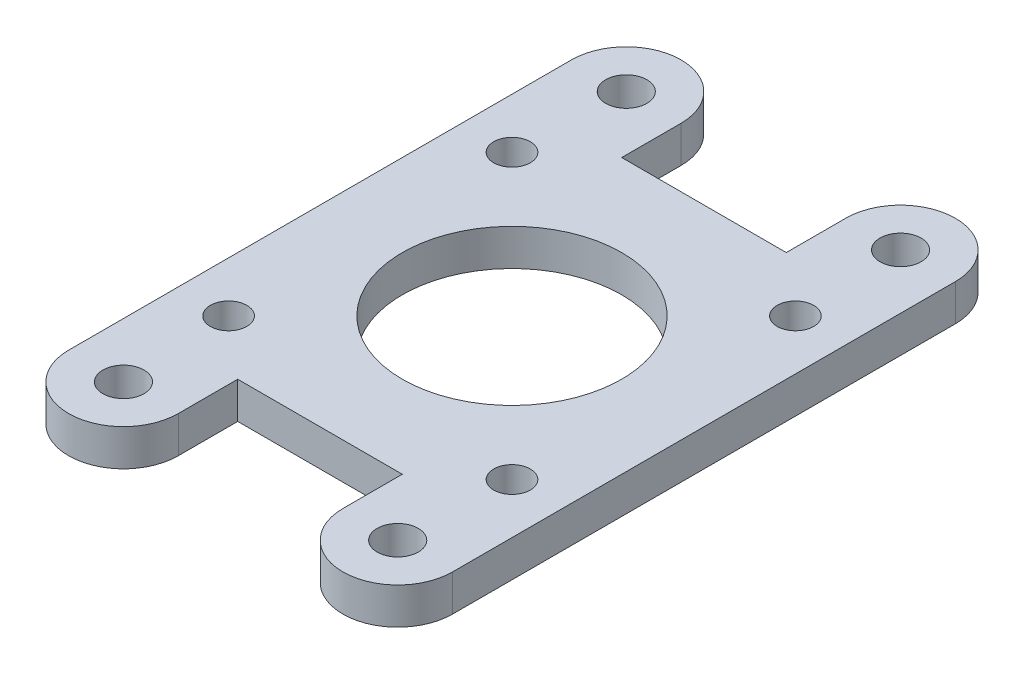
ISO-10303-21;
HEADER;
FILE_DESCRIPTION(('STEP AP214'),'2;1');
FILE_NAME('part.step','',(''),(''),'','','');
FILE_SCHEMA(('AUTOMOTIVE_DESIGN { 1 0 10303 214 1 1 1 1 }'));
ENDSEC;
DATA;
#1=APPLICATION_CONTEXT('core data for automotive mechanical design processes');
#2=APPLICATION_PROTOCOL_DEFINITION('international standard','automotive_design',2000,#1);
#3=PRODUCT_CONTEXT('',#1,'mechanical');
#4=PRODUCT('Part','Part','',(#3));
#5=PRODUCT_RELATED_PRODUCT_CATEGORY('part','',(#4));
#6=PRODUCT_DEFINITION_FORMATION('','',#4);
#7=PRODUCT_DEFINITION_CONTEXT('part definition',#1,'design');
#8=PRODUCT_DEFINITION('design','',#6,#7);
#9=PRODUCT_DEFINITION_SHAPE('','',#8);
#10=(LENGTH_UNIT() NAMED_UNIT(*) SI_UNIT(.MILLI.,.METRE.));
#11=(NAMED_UNIT(*) PLANE_ANGLE_UNIT() SI_UNIT($,.RADIAN.));
#12=(NAMED_UNIT(*) SI_UNIT($,.STERADIAN.) SOLID_ANGLE_UNIT());
#13=UNCERTAINTY_MEASURE_WITH_UNIT(LENGTH_MEASURE(1.E-05),#10,'distance_accuracy_value','');
#14=(GEOMETRIC_REPRESENTATION_CONTEXT(3) GLOBAL_UNCERTAINTY_ASSIGNED_CONTEXT((#13)) GLOBAL_UNIT_ASSIGNED_CONTEXT((#10,
#11,#12)) REPRESENTATION_CONTEXT('',''));
#15=CARTESIAN_POINT('',(0.,0.,0.));
#16=DIRECTION('',(0.,0.,1.));
#17=DIRECTION('',(1.,0.,0.));
#18=AXIS2_PLACEMENT_3D('',#15,#16,#17);
#19=CARTESIAN_POINT('',(-21.,-4.,-21.));
#20=DIRECTION('',(-1.,0.,0.));
#21=DIRECTION('',(0.,0.,1.));
#22=AXIS2_PLACEMENT_3D('',#19,#20,#21);
#23=PLANE('',#22);
#24=DIRECTION('',(0.,0.,1.));
#25=VECTOR('',#24,1.);
#26=CARTESIAN_POINT('',(-21.,0.,-21.));
#27=LINE('',#26,#25);
#28=CARTESIAN_POINT('',(-21.,0.,-27.5));
#29=VERTEX_POINT('',#28);
#30=CARTESIAN_POINT('',(-21.,0.,27.5));
#31=VERTEX_POINT('',#30);
#32=EDGE_CURVE('E230',#29,#31,#27,.T.);
#33=ORIENTED_EDGE('',*,*,#32,.F.);
#34=DIRECTION('',(0.,1.,0.));
#35=VECTOR('',#34,1.);
#36=CARTESIAN_POINT('',(-21.,-4.,-27.5));
#37=LINE('',#36,#35);
#38=CARTESIAN_POINT('',(-21.,-4.,-27.5));
#39=VERTEX_POINT('',#38);
#40=EDGE_CURVE('E208',#39,#29,#37,.T.);
#41=ORIENTED_EDGE('',*,*,#40,.F.);
#42=DIRECTION('',(0.,0.,1.));
#43=VECTOR('',#42,1.);
#44=CARTESIAN_POINT('',(-21.,-4.,-21.));
#45=LINE('',#44,#43);
#46=CARTESIAN_POINT('',(-21.,-4.,27.5));
#47=VERTEX_POINT('',#46);
#48=EDGE_CURVE('E231',#39,#47,#45,.T.);
#49=ORIENTED_EDGE('',*,*,#48,.T.);
#50=DIRECTION('',(0.,1.,0.));
#51=VECTOR('',#50,1.);
#52=CARTESIAN_POINT('',(-21.,-4.,27.5));
#53=LINE('',#52,#51);
#54=EDGE_CURVE('E221',#47,#31,#53,.T.);
#55=ORIENTED_EDGE('',*,*,#54,.T.);
#56=EDGE_LOOP('',(#33,#41,#49,#55));
#57=FACE_BOUND('',#56,.T.);
#58=ADVANCED_FACE('F48',(#57),#23,.T.);
#59=CARTESIAN_POINT('',(-21.,-4.,-21.));
#60=DIRECTION('',(0.,0.,-1.));
#61=DIRECTION('',(-1.,0.,0.));
#62=AXIS2_PLACEMENT_3D('',#59,#60,#61);
#63=PLANE('',#62);
#64=DIRECTION('',(0.,1.,0.));
#65=VECTOR('',#64,1.);
#66=CARTESIAN_POINT('',(8.99999999999997,-4.,-21.));
#67=LINE('',#66,#65);
#68=CARTESIAN_POINT('',(8.99999999999997,-4.,-21.));
#69=VERTEX_POINT('',#68);
#70=CARTESIAN_POINT('',(8.99999999999996,0.,-21.));
#71=VERTEX_POINT('',#70);
#72=EDGE_CURVE('E184',#69,#71,#67,.T.);
#73=ORIENTED_EDGE('',*,*,#72,.F.);
#74=DIRECTION('',(-1.,0.,0.));
#75=VECTOR('',#74,1.);
#76=CARTESIAN_POINT('',(-21.,-4.,-21.));
#77=LINE('',#76,#75);
#78=CARTESIAN_POINT('',(-8.99999999999999,-4.,-21.));
#79=VERTEX_POINT('',#78);
#80=EDGE_CURVE('E13',#69,#79,#77,.T.);
#81=ORIENTED_EDGE('',*,*,#80,.T.);
#82=DIRECTION('',(0.,-1.,0.));
#83=VECTOR('',#82,1.);
#84=CARTESIAN_POINT('',(-8.99999999999999,-4.,-21.));
#85=LINE('',#84,#83);
#86=CARTESIAN_POINT('',(-8.99999999999999,0.,-21.));
#87=VERTEX_POINT('',#86);
#88=EDGE_CURVE('E227',#87,#79,#85,.T.);
#89=ORIENTED_EDGE('',*,*,#88,.F.);
#90=DIRECTION('',(-1.,0.,0.));
#91=VECTOR('',#90,1.);
#92=CARTESIAN_POINT('',(-21.,0.,-21.));
#93=LINE('',#92,#91);
#94=EDGE_CURVE('E51',#71,#87,#93,.T.);
#95=ORIENTED_EDGE('',*,*,#94,.F.);
#96=EDGE_LOOP('',(#73,#81,#89,#95));
#97=FACE_BOUND('',#96,.T.);
#98=ADVANCED_FACE('F250',(#97),#63,.T.);
#99=CARTESIAN_POINT('',(21.,-4.,-21.));
#100=DIRECTION('',(1.,0.,0.));
#101=DIRECTION('',(0.,0.,-1.));
#102=AXIS2_PLACEMENT_3D('',#99,#100,#101);
#103=PLANE('',#102);
#104=DIRECTION('',(0.,0.,-1.));
#105=VECTOR('',#104,1.);
#106=CARTESIAN_POINT('',(21.,0.,-21.));
#107=LINE('',#106,#105);
#108=CARTESIAN_POINT('',(21.,0.,27.5));
#109=VERTEX_POINT('',#108);
#110=CARTESIAN_POINT('',(21.,0.,-27.5));
#111=VERTEX_POINT('',#110);
#112=EDGE_CURVE('E239',#109,#111,#107,.T.);
#113=ORIENTED_EDGE('',*,*,#112,.F.);
#114=DIRECTION('',(0.,1.,0.));
#115=VECTOR('',#114,1.);
#116=CARTESIAN_POINT('',(21.,-4.,27.5));
#117=LINE('',#116,#115);
#118=CARTESIAN_POINT('',(21.,-4.,27.5));
#119=VERTEX_POINT('',#118);
#120=EDGE_CURVE('E178',#119,#109,#117,.T.);
#121=ORIENTED_EDGE('',*,*,#120,.F.);
#122=DIRECTION('',(0.,0.,-1.));
#123=VECTOR('',#122,1.);
#124=CARTESIAN_POINT('',(21.,-4.,-21.));
#125=LINE('',#124,#123);
#126=CARTESIAN_POINT('',(21.,-4.,-27.5));
#127=VERTEX_POINT('',#126);
#128=EDGE_CURVE('E56',#119,#127,#125,.T.);
#129=ORIENTED_EDGE('',*,*,#128,.T.);
#130=DIRECTION('',(0.,1.,0.));
#131=VECTOR('',#130,1.);
#132=CARTESIAN_POINT('',(21.,-4.,-27.5));
#133=LINE('',#132,#131);
#134=EDGE_CURVE('E160',#127,#111,#133,.T.);
#135=ORIENTED_EDGE('',*,*,#134,.T.);
#136=EDGE_LOOP('',(#113,#121,#129,#135));
#137=FACE_BOUND('',#136,.T.);
#138=ADVANCED_FACE('F252',(#137),#103,.T.);
#139=CARTESIAN_POINT('',(-21.,-4.,21.));
#140=DIRECTION('',(0.,0.,1.));
#141=DIRECTION('',(1.,0.,0.));
#142=AXIS2_PLACEMENT_3D('',#139,#140,#141);
#143=PLANE('',#142);
#144=DIRECTION('',(0.,-1.,0.));
#145=VECTOR('',#144,1.);
#146=CARTESIAN_POINT('',(8.99999999999997,-4.,21.));
#147=LINE('',#146,#145);
#148=CARTESIAN_POINT('',(8.99999999999997,0.,21.));
#149=VERTEX_POINT('',#148);
#150=CARTESIAN_POINT('',(8.99999999999997,-4.,21.));
#151=VERTEX_POINT('',#150);
#152=EDGE_CURVE('E177',#149,#151,#147,.T.);
#153=ORIENTED_EDGE('',*,*,#152,.F.);
#154=DIRECTION('',(1.,0.,0.));
#155=VECTOR('',#154,1.);
#156=CARTESIAN_POINT('',(-21.,0.,21.));
#157=LINE('',#156,#155);
#158=CARTESIAN_POINT('',(-8.99999999999999,0.,21.));
#159=VERTEX_POINT('',#158);
#160=EDGE_CURVE('E238',#159,#149,#157,.T.);
#161=ORIENTED_EDGE('',*,*,#160,.F.);
#162=DIRECTION('',(0.,1.,0.));
#163=VECTOR('',#162,1.);
#164=CARTESIAN_POINT('',(-8.99999999999999,-4.,21.));
#165=LINE('',#164,#163);
#166=CARTESIAN_POINT('',(-8.99999999999999,-4.,21.));
#167=VERTEX_POINT('',#166);
#168=EDGE_CURVE('E218',#167,#159,#165,.T.);
#169=ORIENTED_EDGE('',*,*,#168,.F.);
#170=DIRECTION('',(1.,0.,0.));
#171=VECTOR('',#170,1.);
#172=CARTESIAN_POINT('',(-21.,-4.,21.));
#173=LINE('',#172,#171);
#174=EDGE_CURVE('E233',#167,#151,#173,.T.);
#175=ORIENTED_EDGE('',*,*,#174,.T.);
#176=EDGE_LOOP('',(#153,#161,#169,#175));
#177=FACE_BOUND('',#176,.T.);
#178=ADVANCED_FACE('F258',(#177),#143,.T.);
#179=CARTESIAN_POINT('',(0.,-4.,0.));
#180=DIRECTION('',(0.,1.,0.));
#181=DIRECTION('',(0.,0.,1.));
#182=AXIS2_PLACEMENT_3D('',#179,#180,#181);
#183=PLANE('',#182);
#184=CARTESIAN_POINT('',(-15.5,-4.,-15.5));
#185=DIRECTION('',(0.,1.,0.));
#186=DIRECTION('',(0.,0.,1.));
#187=AXIS2_PLACEMENT_3D('',#184,#185,#186);
#188=CIRCLE('',#187,2.);
#189=CARTESIAN_POINT('',(-15.5,-4.,-13.5));
#190=VERTEX_POINT('',#189);
#191=EDGE_CURVE('E351',#190,#190,#188,.T.);
#192=ORIENTED_EDGE('',*,*,#191,.T.);
#193=EDGE_LOOP('',(#192));
#194=FACE_BOUND('',#193,.T.);
#195=CARTESIAN_POINT('',(-15.5,-4.,15.5));
#196=DIRECTION('',(0.,1.,0.));
#197=DIRECTION('',(0.,0.,1.));
#198=AXIS2_PLACEMENT_3D('',#195,#196,#197);
#199=CIRCLE('',#198,2.);
#200=CARTESIAN_POINT('',(-15.5,-4.,17.5));
#201=VERTEX_POINT('',#200);
#202=EDGE_CURVE('E360',#201,#201,#199,.T.);
#203=ORIENTED_EDGE('',*,*,#202,.T.);
#204=EDGE_LOOP('',(#203));
#205=FACE_BOUND('',#204,.T.);
#206=CARTESIAN_POINT('',(15.5,-4.,15.5));
#207=DIRECTION('',(0.,1.,0.));
#208=DIRECTION('',(0.,0.,1.));
#209=AXIS2_PLACEMENT_3D('',#206,#207,#208);
#210=CIRCLE('',#209,2.);
#211=CARTESIAN_POINT('',(15.5,-4.,17.5));
#212=VERTEX_POINT('',#211);
#213=EDGE_CURVE('E366',#212,#212,#210,.T.);
#214=ORIENTED_EDGE('',*,*,#213,.T.);
#215=EDGE_LOOP('',(#214));
#216=FACE_BOUND('',#215,.T.);
#217=CARTESIAN_POINT('',(15.5,-4.,-15.5));
#218=DIRECTION('',(0.,1.,0.));
#219=DIRECTION('',(0.,0.,1.));
#220=AXIS2_PLACEMENT_3D('',#217,#218,#219);
#221=CIRCLE('',#220,2.);
#222=CARTESIAN_POINT('',(15.5,-4.,-13.5));
#223=VERTEX_POINT('',#222);
#224=EDGE_CURVE('E372',#223,#223,#221,.T.);
#225=ORIENTED_EDGE('',*,*,#224,.T.);
#226=EDGE_LOOP('',(#225));
#227=FACE_BOUND('',#226,.T.);
#228=CARTESIAN_POINT('',(0.,-4.,0.));
#229=DIRECTION('',(0.,1.,0.));
#230=DIRECTION('',(0.,0.,1.));
#231=AXIS2_PLACEMENT_3D('',#228,#229,#230);
#232=CIRCLE('',#231,12.);
#233=CARTESIAN_POINT('',(0.,-4.,12.));
#234=VERTEX_POINT('',#233);
#235=EDGE_CURVE('E378',#234,#234,#232,.T.);
#236=ORIENTED_EDGE('',*,*,#235,.T.);
#237=EDGE_LOOP('',(#236));
#238=FACE_BOUND('',#237,.T.);
#239=ORIENTED_EDGE('',*,*,#80,.F.);
#240=DIRECTION('',(0.,0.,1.));
#241=VECTOR('',#240,1.);
#242=CARTESIAN_POINT('',(8.99999999999997,-4.,-27.5));
#243=LINE('',#242,#241);
#244=CARTESIAN_POINT('',(8.99999999999997,-4.,-27.5));
#245=VERTEX_POINT('',#244);
#246=EDGE_CURVE('E140',#245,#69,#243,.T.);
#247=ORIENTED_EDGE('',*,*,#246,.F.);
#248=CARTESIAN_POINT('',(15.,-4.,-27.5));
#249=DIRECTION('',(0.,1.,0.));
#250=DIRECTION('',(0.,0.,1.));
#251=AXIS2_PLACEMENT_3D('',#248,#249,#250);
#252=CIRCLE('',#251,6.00000000000002);
#253=EDGE_CURVE('E153',#127,#245,#252,.T.);
#254=ORIENTED_EDGE('',*,*,#253,.F.);
#255=ORIENTED_EDGE('',*,*,#128,.F.);
#256=CARTESIAN_POINT('',(15.,-4.,27.5));
#257=DIRECTION('',(0.,1.,0.));
#258=DIRECTION('',(0.,0.,1.));
#259=AXIS2_PLACEMENT_3D('',#256,#257,#258);
#260=CIRCLE('',#259,6.00000000000002);
#261=CARTESIAN_POINT('',(8.99999999999997,-4.,27.5));
#262=VERTEX_POINT('',#261);
#263=EDGE_CURVE('E146',#262,#119,#260,.T.);
#264=ORIENTED_EDGE('',*,*,#263,.F.);
#265=EDGE_CURVE('E155',#151,#262,#243,.T.);
#266=ORIENTED_EDGE('',*,*,#265,.F.);
#267=ORIENTED_EDGE('',*,*,#174,.F.);
#268=DIRECTION('',(0.,0.,-1.));
#269=VECTOR('',#268,1.);
#270=CARTESIAN_POINT('',(-8.99999999999999,-4.,-27.5));
#271=LINE('',#270,#269);
#272=CARTESIAN_POINT('',(-8.99999999999999,-4.,27.5));
#273=VERTEX_POINT('',#272);
#274=EDGE_CURVE('E206',#273,#167,#271,.T.);
#275=ORIENTED_EDGE('',*,*,#274,.F.);
#276=CARTESIAN_POINT('',(-15.,-4.,27.5));
#277=DIRECTION('',(0.,1.,0.));
#278=DIRECTION('',(0.,0.,1.));
#279=AXIS2_PLACEMENT_3D('',#276,#277,#278);
#280=CIRCLE('',#279,6.00000000000001);
#281=EDGE_CURVE('E202',#47,#273,#280,.T.);
#282=ORIENTED_EDGE('',*,*,#281,.F.);
#283=ORIENTED_EDGE('',*,*,#48,.F.);
#284=CARTESIAN_POINT('',(-15.,-4.,-27.5));
#285=DIRECTION('',(0.,1.,0.));
#286=DIRECTION('',(0.,0.,1.));
#287=AXIS2_PLACEMENT_3D('',#284,#285,#286);
#288=CIRCLE('',#287,6.00000000000001);
#289=CARTESIAN_POINT('',(-8.99999999999999,-4.,-27.5));
#290=VERTEX_POINT('',#289);
#291=EDGE_CURVE('E199',#290,#39,#288,.T.);
#292=ORIENTED_EDGE('',*,*,#291,.F.);
#293=EDGE_CURVE('E205',#79,#290,#271,.T.);
#294=ORIENTED_EDGE('',*,*,#293,.F.);
#295=EDGE_LOOP('',(#239,#247,#254,#255,#264,#266,#267,#275,#282,#283,#292,#294));
#296=FACE_BOUND('',#295,.T.);
#297=CARTESIAN_POINT('',(-15.,-4.,27.5));
#298=DIRECTION('',(0.,1.,0.));
#299=DIRECTION('',(0.,0.,1.));
#300=AXIS2_PLACEMENT_3D('',#297,#298,#299);
#301=CIRCLE('',#300,2.25);
#302=CARTESIAN_POINT('',(-15.,-4.,29.75));
#303=VERTEX_POINT('',#302);
#304=EDGE_CURVE('E187',#303,#303,#301,.T.);
#305=ORIENTED_EDGE('',*,*,#304,.T.);
#306=EDGE_LOOP('',(#305));
#307=FACE_BOUND('',#306,.T.);
#308=CARTESIAN_POINT('',(-15.,-4.,-27.5));
#309=DIRECTION('',(0.,1.,0.));
#310=DIRECTION('',(0.,0.,1.));
#311=AXIS2_PLACEMENT_3D('',#308,#309,#310);
#312=CIRCLE('',#311,2.25);
#313=CARTESIAN_POINT('',(-15.,-4.,-25.25));
#314=VERTEX_POINT('',#313);
#315=EDGE_CURVE('E193',#314,#314,#312,.T.);
#316=ORIENTED_EDGE('',*,*,#315,.T.);
#317=EDGE_LOOP('',(#316));
#318=FACE_BOUND('',#317,.T.);
#319=CARTESIAN_POINT('',(15.,-4.,27.5));
#320=DIRECTION('',(0.,1.,0.));
#321=DIRECTION('',(0.,0.,1.));
#322=AXIS2_PLACEMENT_3D('',#319,#320,#321);
#323=CIRCLE('',#322,2.25);
#324=CARTESIAN_POINT('',(15.,-4.,29.75));
#325=VERTEX_POINT('',#324);
#326=EDGE_CURVE('E384',#325,#325,#323,.T.);
#327=ORIENTED_EDGE('',*,*,#326,.T.);
#328=EDGE_LOOP('',(#327));
#329=FACE_BOUND('',#328,.T.);
#330=CARTESIAN_POINT('',(15.,-4.,-27.5));
#331=DIRECTION('',(0.,1.,0.));
#332=DIRECTION('',(0.,0.,1.));
#333=AXIS2_PLACEMENT_3D('',#330,#331,#332);
#334=CIRCLE('',#333,2.25);
#335=CARTESIAN_POINT('',(15.,-4.,-25.25));
#336=VERTEX_POINT('',#335);
#337=EDGE_CURVE('E174',#336,#336,#334,.T.);
#338=ORIENTED_EDGE('',*,*,#337,.T.);
#339=EDGE_LOOP('',(#338));
#340=FACE_BOUND('',#339,.T.);
#341=ADVANCED_FACE('F151',(#194,#205,#216,#227,#238,#296,#307,#318,#329,#340),#183,.F.);
#342=CARTESIAN_POINT('',(0.,0.,0.));
#343=DIRECTION('',(0.,1.,0.));
#344=DIRECTION('',(0.,0.,1.));
#345=AXIS2_PLACEMENT_3D('',#342,#343,#344);
#346=PLANE('',#345);
#347=CARTESIAN_POINT('',(-15.5,0.,-15.5));
#348=DIRECTION('',(0.,1.,0.));
#349=DIRECTION('',(0.,0.,1.));
#350=AXIS2_PLACEMENT_3D('',#347,#348,#349);
#351=CIRCLE('',#350,2.);
#352=CARTESIAN_POINT('',(-15.5,0.,-13.5));
#353=VERTEX_POINT('',#352);
#354=EDGE_CURVE('E354',#353,#353,#351,.T.);
#355=ORIENTED_EDGE('',*,*,#354,.F.);
#356=EDGE_LOOP('',(#355));
#357=FACE_BOUND('',#356,.T.);
#358=CARTESIAN_POINT('',(-15.5,0.,15.5));
#359=DIRECTION('',(0.,1.,0.));
#360=DIRECTION('',(0.,0.,1.));
#361=AXIS2_PLACEMENT_3D('',#358,#359,#360);
#362=CIRCLE('',#361,2.);
#363=CARTESIAN_POINT('',(-15.5,0.,17.5));
#364=VERTEX_POINT('',#363);
#365=EDGE_CURVE('E357',#364,#364,#362,.T.);
#366=ORIENTED_EDGE('',*,*,#365,.F.);
#367=EDGE_LOOP('',(#366));
#368=FACE_BOUND('',#367,.T.);
#369=CARTESIAN_POINT('',(15.5,0.,15.5));
#370=DIRECTION('',(0.,1.,0.));
#371=DIRECTION('',(0.,0.,1.));
#372=AXIS2_PLACEMENT_3D('',#369,#370,#371);
#373=CIRCLE('',#372,2.);
#374=CARTESIAN_POINT('',(15.5,0.,17.5));
#375=VERTEX_POINT('',#374);
#376=EDGE_CURVE('E363',#375,#375,#373,.T.);
#377=ORIENTED_EDGE('',*,*,#376,.F.);
#378=EDGE_LOOP('',(#377));
#379=FACE_BOUND('',#378,.T.);
#380=CARTESIAN_POINT('',(15.5,0.,-15.5));
#381=DIRECTION('',(0.,1.,0.));
#382=DIRECTION('',(0.,0.,1.));
#383=AXIS2_PLACEMENT_3D('',#380,#381,#382);
#384=CIRCLE('',#383,2.);
#385=CARTESIAN_POINT('',(15.5,0.,-13.5));
#386=VERTEX_POINT('',#385);
#387=EDGE_CURVE('E369',#386,#386,#384,.T.);
#388=ORIENTED_EDGE('',*,*,#387,.F.);
#389=EDGE_LOOP('',(#388));
#390=FACE_BOUND('',#389,.T.);
#391=CARTESIAN_POINT('',(0.,0.,0.));
#392=DIRECTION('',(0.,1.,0.));
#393=DIRECTION('',(0.,0.,1.));
#394=AXIS2_PLACEMENT_3D('',#391,#392,#393);
#395=CIRCLE('',#394,12.);
#396=CARTESIAN_POINT('',(0.,0.,12.));
#397=VERTEX_POINT('',#396);
#398=EDGE_CURVE('E375',#397,#397,#395,.T.);
#399=ORIENTED_EDGE('',*,*,#398,.F.);
#400=EDGE_LOOP('',(#399));
#401=FACE_BOUND('',#400,.T.);
#402=ORIENTED_EDGE('',*,*,#160,.T.);
#403=DIRECTION('',(0.,0.,1.));
#404=VECTOR('',#403,1.);
#405=CARTESIAN_POINT('',(8.99999999999997,0.,-27.5));
#406=LINE('',#405,#404);
#407=CARTESIAN_POINT('',(8.99999999999997,0.,27.5));
#408=VERTEX_POINT('',#407);
#409=EDGE_CURVE('E173',#149,#408,#406,.T.);
#410=ORIENTED_EDGE('',*,*,#409,.T.);
#411=CARTESIAN_POINT('',(15.,0.,27.5));
#412=DIRECTION('',(0.,1.,0.));
#413=DIRECTION('',(0.,0.,1.));
#414=AXIS2_PLACEMENT_3D('',#411,#412,#413);
#415=CIRCLE('',#414,6.00000000000002);
#416=EDGE_CURVE('E161',#408,#109,#415,.T.);
#417=ORIENTED_EDGE('',*,*,#416,.T.);
#418=ORIENTED_EDGE('',*,*,#112,.T.);
#419=CARTESIAN_POINT('',(15.,0.,-27.5));
#420=DIRECTION('',(0.,1.,0.));
#421=DIRECTION('',(0.,0.,1.));
#422=AXIS2_PLACEMENT_3D('',#419,#420,#421);
#423=CIRCLE('',#422,6.00000000000002);
#424=CARTESIAN_POINT('',(8.99999999999997,0.,-27.5));
#425=VERTEX_POINT('',#424);
#426=EDGE_CURVE('E171',#111,#425,#423,.T.);
#427=ORIENTED_EDGE('',*,*,#426,.T.);
#428=EDGE_CURVE('E64',#425,#71,#406,.T.);
#429=ORIENTED_EDGE('',*,*,#428,.T.);
#430=ORIENTED_EDGE('',*,*,#94,.T.);
#431=DIRECTION('',(0.,0.,-1.));
#432=VECTOR('',#431,1.);
#433=CARTESIAN_POINT('',(-8.99999999999999,0.,-27.5));
#434=LINE('',#433,#432);
#435=CARTESIAN_POINT('',(-8.99999999999999,0.,-27.5));
#436=VERTEX_POINT('',#435);
#437=EDGE_CURVE('E213',#87,#436,#434,.T.);
#438=ORIENTED_EDGE('',*,*,#437,.T.);
#439=CARTESIAN_POINT('',(-15.,0.,-27.5));
#440=DIRECTION('',(0.,1.,0.));
#441=DIRECTION('',(0.,0.,1.));
#442=AXIS2_PLACEMENT_3D('',#439,#440,#441);
#443=CIRCLE('',#442,6.00000000000001);
#444=EDGE_CURVE('E196',#436,#29,#443,.T.);
#445=ORIENTED_EDGE('',*,*,#444,.T.);
#446=ORIENTED_EDGE('',*,*,#32,.T.);
#447=CARTESIAN_POINT('',(-15.,0.,27.5));
#448=DIRECTION('',(0.,1.,0.));
#449=DIRECTION('',(0.,0.,1.));
#450=AXIS2_PLACEMENT_3D('',#447,#448,#449);
#451=CIRCLE('',#450,6.00000000000001);
#452=CARTESIAN_POINT('',(-8.99999999999999,0.,27.5));
#453=VERTEX_POINT('',#452);
#454=EDGE_CURVE('E211',#31,#453,#451,.T.);
#455=ORIENTED_EDGE('',*,*,#454,.T.);
#456=EDGE_CURVE('E71',#453,#159,#434,.T.);
#457=ORIENTED_EDGE('',*,*,#456,.T.);
#458=EDGE_LOOP('',(#402,#410,#417,#418,#427,#429,#430,#438,#445,#446,#455,#457));
#459=FACE_BOUND('',#458,.T.);
#460=CARTESIAN_POINT('',(-15.,0.,27.5));
#461=DIRECTION('',(0.,1.,0.));
#462=DIRECTION('',(0.,0.,1.));
#463=AXIS2_PLACEMENT_3D('',#460,#461,#462);
#464=CIRCLE('',#463,2.25);
#465=CARTESIAN_POINT('',(-15.,0.,29.75));
#466=VERTEX_POINT('',#465);
#467=EDGE_CURVE('E186',#466,#466,#464,.T.);
#468=ORIENTED_EDGE('',*,*,#467,.F.);
#469=EDGE_LOOP('',(#468));
#470=FACE_BOUND('',#469,.T.);
#471=CARTESIAN_POINT('',(-15.,0.,-27.5));
#472=DIRECTION('',(0.,1.,0.));
#473=DIRECTION('',(0.,0.,1.));
#474=AXIS2_PLACEMENT_3D('',#471,#472,#473);
#475=CIRCLE('',#474,2.25);
#476=CARTESIAN_POINT('',(-15.,0.,-25.25));
#477=VERTEX_POINT('',#476);
#478=EDGE_CURVE('E190',#477,#477,#475,.T.);
#479=ORIENTED_EDGE('',*,*,#478,.F.);
#480=EDGE_LOOP('',(#479));
#481=FACE_BOUND('',#480,.T.);
#482=CARTESIAN_POINT('',(15.,0.,27.5));
#483=DIRECTION('',(0.,1.,0.));
#484=DIRECTION('',(0.,0.,1.));
#485=AXIS2_PLACEMENT_3D('',#482,#483,#484);
#486=CIRCLE('',#485,2.25);
#487=CARTESIAN_POINT('',(15.,0.,29.75));
#488=VERTEX_POINT('',#487);
#489=EDGE_CURVE('E381',#488,#488,#486,.T.);
#490=ORIENTED_EDGE('',*,*,#489,.F.);
#491=EDGE_LOOP('',(#490));
#492=FACE_BOUND('',#491,.T.);
#493=CARTESIAN_POINT('',(15.,0.,-27.5));
#494=DIRECTION('',(0.,1.,0.));
#495=DIRECTION('',(0.,0.,1.));
#496=AXIS2_PLACEMENT_3D('',#493,#494,#495);
#497=CIRCLE('',#496,2.25);
#498=CARTESIAN_POINT('',(15.,0.,-25.25));
#499=VERTEX_POINT('',#498);
#500=EDGE_CURVE('E166',#499,#499,#497,.T.);
#501=ORIENTED_EDGE('',*,*,#500,.F.);
#502=EDGE_LOOP('',(#501));
#503=FACE_BOUND('',#502,.T.);
#504=ADVANCED_FACE('F242',(#357,#368,#379,#390,#401,#459,#470,#481,#492,#503),#346,.T.);
#505=CARTESIAN_POINT('',(-15.,-4.,27.5));
#506=DIRECTION('',(0.,1.,0.));
#507=DIRECTION('',(0.,0.,1.));
#508=AXIS2_PLACEMENT_3D('',#505,#506,#507);
#509=CYLINDRICAL_SURFACE('',#508,6.00000000000001);
#510=ORIENTED_EDGE('',*,*,#454,.F.);
#511=ORIENTED_EDGE('',*,*,#54,.F.);
#512=ORIENTED_EDGE('',*,*,#281,.T.);
#513=DIRECTION('',(0.,1.,0.));
#514=VECTOR('',#513,1.);
#515=CARTESIAN_POINT('',(-8.99999999999999,-4.,27.5));
#516=LINE('',#515,#514);
#517=EDGE_CURVE('E219',#273,#453,#516,.T.);
#518=ORIENTED_EDGE('',*,*,#517,.T.);
#519=EDGE_LOOP('',(#510,#511,#512,#518));
#520=FACE_BOUND('',#519,.T.);
#521=ADVANCED_FACE('F290',(#520),#509,.T.);
#522=CARTESIAN_POINT('',(-15.,-4.,27.5));
#523=DIRECTION('',(0.,1.,0.));
#524=DIRECTION('',(0.,0.,1.));
#525=AXIS2_PLACEMENT_3D('',#522,#523,#524);
#526=CYLINDRICAL_SURFACE('',#525,2.25);
#527=ORIENTED_EDGE('',*,*,#304,.F.);
#528=EDGE_LOOP('',(#527));
#529=FACE_BOUND('',#528,.T.);
#530=ORIENTED_EDGE('',*,*,#467,.T.);
#531=EDGE_LOOP('',(#530));
#532=FACE_BOUND('',#531,.T.);
#533=ADVANCED_FACE('F307',(#529,#532),#526,.F.);
#534=CARTESIAN_POINT('',(-8.99999999999999,-4.,-27.5));
#535=DIRECTION('',(1.,0.,0.));
#536=DIRECTION('',(0.,0.,-1.));
#537=AXIS2_PLACEMENT_3D('',#534,#535,#536);
#538=PLANE('',#537);
#539=ORIENTED_EDGE('',*,*,#274,.T.);
#540=ORIENTED_EDGE('',*,*,#168,.T.);
#541=ORIENTED_EDGE('',*,*,#456,.F.);
#542=ORIENTED_EDGE('',*,*,#517,.F.);
#543=EDGE_LOOP('',(#539,#540,#541,#542));
#544=FACE_BOUND('',#543,.T.);
#545=ADVANCED_FACE('F286',(#544),#538,.T.);
#546=ORIENTED_EDGE('',*,*,#437,.F.);
#547=ORIENTED_EDGE('',*,*,#88,.T.);
#548=ORIENTED_EDGE('',*,*,#293,.T.);
#549=DIRECTION('',(0.,1.,0.));
#550=VECTOR('',#549,1.);
#551=CARTESIAN_POINT('',(-8.99999999999999,-4.,-27.5));
#552=LINE('',#551,#550);
#553=EDGE_CURVE('E215',#290,#436,#552,.T.);
#554=ORIENTED_EDGE('',*,*,#553,.T.);
#555=EDGE_LOOP('',(#546,#547,#548,#554));
#556=FACE_BOUND('',#555,.T.);
#557=ADVANCED_FACE('F247',(#556),#538,.T.);
#558=CARTESIAN_POINT('',(-15.,-4.,-27.5));
#559=DIRECTION('',(0.,1.,0.));
#560=DIRECTION('',(0.,0.,1.));
#561=AXIS2_PLACEMENT_3D('',#558,#559,#560);
#562=CYLINDRICAL_SURFACE('',#561,6.00000000000001);
#563=ORIENTED_EDGE('',*,*,#444,.F.);
#564=ORIENTED_EDGE('',*,*,#553,.F.);
#565=ORIENTED_EDGE('',*,*,#291,.T.);
#566=ORIENTED_EDGE('',*,*,#40,.T.);
#567=EDGE_LOOP('',(#563,#564,#565,#566));
#568=FACE_BOUND('',#567,.T.);
#569=ADVANCED_FACE('F294',(#568),#562,.T.);
#570=CARTESIAN_POINT('',(-15.,-4.,-27.5));
#571=DIRECTION('',(0.,1.,0.));
#572=DIRECTION('',(0.,0.,1.));
#573=AXIS2_PLACEMENT_3D('',#570,#571,#572);
#574=CYLINDRICAL_SURFACE('',#573,2.25);
#575=ORIENTED_EDGE('',*,*,#315,.F.);
#576=EDGE_LOOP('',(#575));
#577=FACE_BOUND('',#576,.T.);
#578=ORIENTED_EDGE('',*,*,#478,.T.);
#579=EDGE_LOOP('',(#578));
#580=FACE_BOUND('',#579,.T.);
#581=ADVANCED_FACE('F296',(#577,#580),#574,.F.);
#582=CARTESIAN_POINT('',(15.,-4.,27.5));
#583=DIRECTION('',(0.,1.,0.));
#584=DIRECTION('',(0.,0.,1.));
#585=AXIS2_PLACEMENT_3D('',#582,#583,#584);
#586=CYLINDRICAL_SURFACE('',#585,6.00000000000002);
#587=ORIENTED_EDGE('',*,*,#416,.F.);
#588=DIRECTION('',(0.,1.,0.));
#589=VECTOR('',#588,1.);
#590=CARTESIAN_POINT('',(8.99999999999997,-4.,27.5));
#591=LINE('',#590,#589);
#592=EDGE_CURVE('E145',#262,#408,#591,.T.);
#593=ORIENTED_EDGE('',*,*,#592,.F.);
#594=ORIENTED_EDGE('',*,*,#263,.T.);
#595=ORIENTED_EDGE('',*,*,#120,.T.);
#596=EDGE_LOOP('',(#587,#593,#594,#595));
#597=FACE_BOUND('',#596,.T.);
#598=ADVANCED_FACE('F281',(#597),#586,.T.);
#599=CARTESIAN_POINT('',(15.,-4.,27.5));
#600=DIRECTION('',(0.,1.,0.));
#601=DIRECTION('',(0.,0.,1.));
#602=AXIS2_PLACEMENT_3D('',#599,#600,#601);
#603=CYLINDRICAL_SURFACE('',#602,2.25);
#604=ORIENTED_EDGE('',*,*,#326,.F.);
#605=EDGE_LOOP('',(#604));
#606=FACE_BOUND('',#605,.T.);
#607=ORIENTED_EDGE('',*,*,#489,.T.);
#608=EDGE_LOOP('',(#607));
#609=FACE_BOUND('',#608,.T.);
#610=ADVANCED_FACE('F318',(#606,#609),#603,.F.);
#611=CARTESIAN_POINT('',(8.99999999999997,-4.,-27.5));
#612=DIRECTION('',(-1.,0.,0.));
#613=DIRECTION('',(0.,0.,1.));
#614=AXIS2_PLACEMENT_3D('',#611,#612,#613);
#615=PLANE('',#614);
#616=ORIENTED_EDGE('',*,*,#409,.F.);
#617=ORIENTED_EDGE('',*,*,#152,.T.);
#618=ORIENTED_EDGE('',*,*,#265,.T.);
#619=ORIENTED_EDGE('',*,*,#592,.T.);
#620=EDGE_LOOP('',(#616,#617,#618,#619));
#621=FACE_BOUND('',#620,.T.);
#622=ADVANCED_FACE('F278',(#621),#615,.T.);
#623=ORIENTED_EDGE('',*,*,#246,.T.);
#624=ORIENTED_EDGE('',*,*,#72,.T.);
#625=ORIENTED_EDGE('',*,*,#428,.F.);
#626=DIRECTION('',(0.,1.,0.));
#627=VECTOR('',#626,1.);
#628=CARTESIAN_POINT('',(8.99999999999997,-4.,-27.5));
#629=LINE('',#628,#627);
#630=EDGE_CURVE('E137',#245,#425,#629,.T.);
#631=ORIENTED_EDGE('',*,*,#630,.F.);
#632=EDGE_LOOP('',(#623,#624,#625,#631));
#633=FACE_BOUND('',#632,.T.);
#634=ADVANCED_FACE('F139',(#633),#615,.T.);
#635=CARTESIAN_POINT('',(15.,-4.,-27.5));
#636=DIRECTION('',(0.,1.,0.));
#637=DIRECTION('',(0.,0.,1.));
#638=AXIS2_PLACEMENT_3D('',#635,#636,#637);
#639=CYLINDRICAL_SURFACE('',#638,6.00000000000002);
#640=ORIENTED_EDGE('',*,*,#426,.F.);
#641=ORIENTED_EDGE('',*,*,#134,.F.);
#642=ORIENTED_EDGE('',*,*,#253,.T.);
#643=ORIENTED_EDGE('',*,*,#630,.T.);
#644=EDGE_LOOP('',(#640,#641,#642,#643));
#645=FACE_BOUND('',#644,.T.);
#646=ADVANCED_FACE('F158',(#645),#639,.T.);
#647=CARTESIAN_POINT('',(15.,-4.,-27.5));
#648=DIRECTION('',(0.,1.,0.));
#649=DIRECTION('',(0.,0.,1.));
#650=AXIS2_PLACEMENT_3D('',#647,#648,#649);
#651=CYLINDRICAL_SURFACE('',#650,2.25);
#652=ORIENTED_EDGE('',*,*,#337,.F.);
#653=EDGE_LOOP('',(#652));
#654=FACE_BOUND('',#653,.T.);
#655=ORIENTED_EDGE('',*,*,#500,.T.);
#656=EDGE_LOOP('',(#655));
#657=FACE_BOUND('',#656,.T.);
#658=ADVANCED_FACE('F315',(#654,#657),#651,.F.);
#659=CARTESIAN_POINT('',(0.,-4.,0.));
#660=DIRECTION('',(0.,1.,0.));
#661=DIRECTION('',(0.,0.,1.));
#662=AXIS2_PLACEMENT_3D('',#659,#660,#661);
#663=CYLINDRICAL_SURFACE('',#662,12.);
#664=ORIENTED_EDGE('',*,*,#235,.F.);
#665=EDGE_LOOP('',(#664));
#666=FACE_BOUND('',#665,.T.);
#667=ORIENTED_EDGE('',*,*,#398,.T.);
#668=EDGE_LOOP('',(#667));
#669=FACE_BOUND('',#668,.T.);
#670=ADVANCED_FACE('F323',(#666,#669),#663,.F.);
#671=CARTESIAN_POINT('',(15.5,-4.,-15.5));
#672=DIRECTION('',(0.,1.,0.));
#673=DIRECTION('',(0.,0.,1.));
#674=AXIS2_PLACEMENT_3D('',#671,#672,#673);
#675=CYLINDRICAL_SURFACE('',#674,2.);
#676=ORIENTED_EDGE('',*,*,#224,.F.);
#677=EDGE_LOOP('',(#676));
#678=FACE_BOUND('',#677,.T.);
#679=ORIENTED_EDGE('',*,*,#387,.T.);
#680=EDGE_LOOP('',(#679));
#681=FACE_BOUND('',#680,.T.);
#682=ADVANCED_FACE('F330',(#678,#681),#675,.F.);
#683=CARTESIAN_POINT('',(15.5,-4.,15.5));
#684=DIRECTION('',(0.,1.,0.));
#685=DIRECTION('',(0.,0.,1.));
#686=AXIS2_PLACEMENT_3D('',#683,#684,#685);
#687=CYLINDRICAL_SURFACE('',#686,2.);
#688=ORIENTED_EDGE('',*,*,#213,.F.);
#689=EDGE_LOOP('',(#688));
#690=FACE_BOUND('',#689,.T.);
#691=ORIENTED_EDGE('',*,*,#376,.T.);
#692=EDGE_LOOP('',(#691));
#693=FACE_BOUND('',#692,.T.);
#694=ADVANCED_FACE('F334',(#690,#693),#687,.F.);
#695=CARTESIAN_POINT('',(-15.5,-4.,15.5));
#696=DIRECTION('',(0.,1.,0.));
#697=DIRECTION('',(0.,0.,1.));
#698=AXIS2_PLACEMENT_3D('',#695,#696,#697);
#699=CYLINDRICAL_SURFACE('',#698,2.);
#700=ORIENTED_EDGE('',*,*,#202,.F.);
#701=EDGE_LOOP('',(#700));
#702=FACE_BOUND('',#701,.T.);
#703=ORIENTED_EDGE('',*,*,#365,.T.);
#704=EDGE_LOOP('',(#703));
#705=FACE_BOUND('',#704,.T.);
#706=ADVANCED_FACE('F338',(#702,#705),#699,.F.);
#707=CARTESIAN_POINT('',(-15.5,-4.,-15.5));
#708=DIRECTION('',(0.,1.,0.));
#709=DIRECTION('',(0.,0.,1.));
#710=AXIS2_PLACEMENT_3D('',#707,#708,#709);
#711=CYLINDRICAL_SURFACE('',#710,2.);
#712=ORIENTED_EDGE('',*,*,#191,.F.);
#713=EDGE_LOOP('',(#712));
#714=FACE_BOUND('',#713,.T.);
#715=ORIENTED_EDGE('',*,*,#354,.T.);
#716=EDGE_LOOP('',(#715));
#717=FACE_BOUND('',#716,.T.);
#718=ADVANCED_FACE('F342',(#714,#717),#711,.F.);
#719=CLOSED_SHELL('',(#58,#98,#138,#178,#341,#504,#521,#533,#545,#557,#569,#581,#598,#610,#622,
#634,#646,#658,#670,#682,#694,#706,#718));
#720=MANIFOLD_SOLID_BREP('B2',#719);
#721=ADVANCED_BREP_SHAPE_REPRESENTATION('',(#18,#720),#14);
#722=SHAPE_DEFINITION_REPRESENTATION(#9,#721);
ENDSEC;
END-ISO-10303-21;
